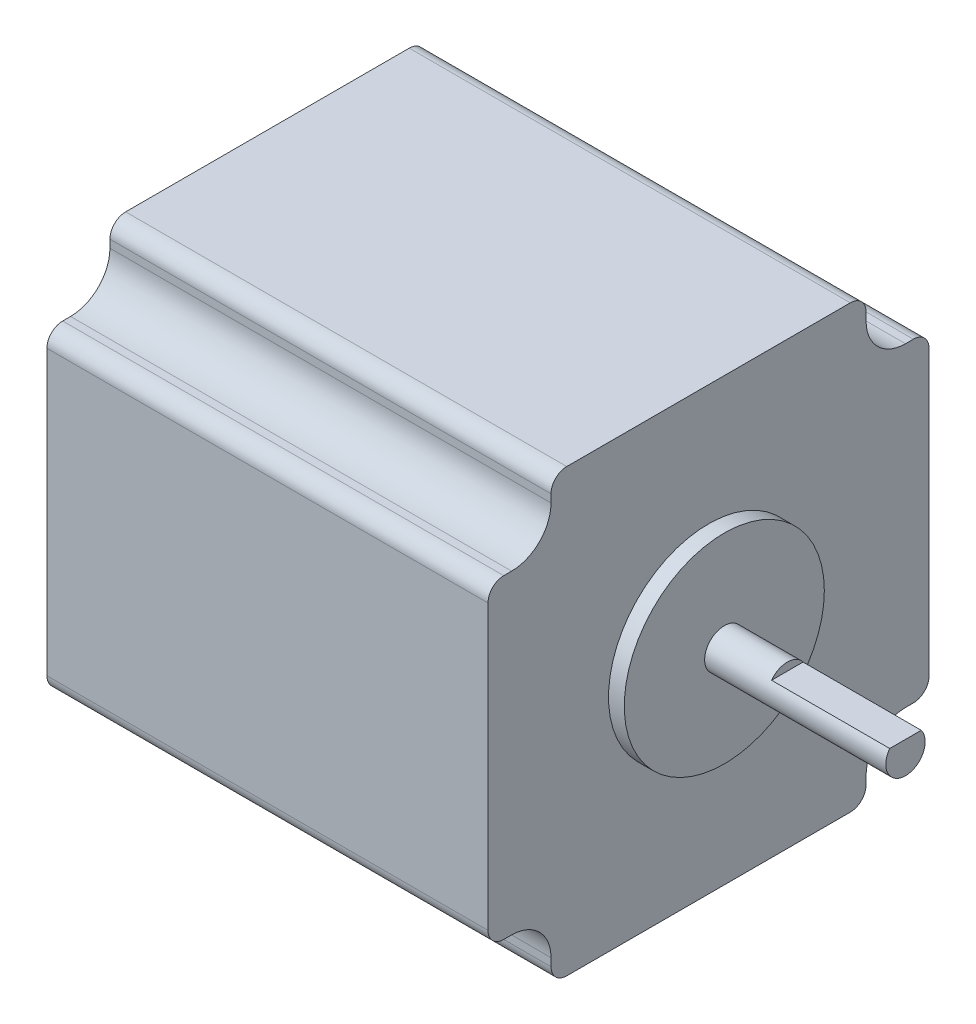
ISO-10303-21;
HEADER;
FILE_DESCRIPTION(('STEP AP214'),'2;1');
FILE_NAME('part.step','',(''),(''),'','','');
FILE_SCHEMA(('AUTOMOTIVE_DESIGN { 1 0 10303 214 1 1 1 1 }'));
ENDSEC;
DATA;
#1=APPLICATION_CONTEXT('core data for automotive mechanical design processes');
#2=APPLICATION_PROTOCOL_DEFINITION('international standard','automotive_design',2000,#1);
#3=PRODUCT_CONTEXT('',#1,'mechanical');
#4=PRODUCT('Part','Part','',(#3));
#5=PRODUCT_RELATED_PRODUCT_CATEGORY('part','',(#4));
#6=PRODUCT_DEFINITION_FORMATION('','',#4);
#7=PRODUCT_DEFINITION_CONTEXT('part definition',#1,'design');
#8=PRODUCT_DEFINITION('design','',#6,#7);
#9=PRODUCT_DEFINITION_SHAPE('','',#8);
#10=(LENGTH_UNIT() NAMED_UNIT(*) SI_UNIT(.MILLI.,.METRE.));
#11=(NAMED_UNIT(*) PLANE_ANGLE_UNIT() SI_UNIT($,.RADIAN.));
#12=(NAMED_UNIT(*) SI_UNIT($,.STERADIAN.) SOLID_ANGLE_UNIT());
#13=UNCERTAINTY_MEASURE_WITH_UNIT(LENGTH_MEASURE(1.E-05),#10,'distance_accuracy_value','');
#14=(GEOMETRIC_REPRESENTATION_CONTEXT(3) GLOBAL_UNCERTAINTY_ASSIGNED_CONTEXT((#13)) GLOBAL_UNIT_ASSIGNED_CONTEXT((#10,
#11,#12)) REPRESENTATION_CONTEXT('',''));
#15=CARTESIAN_POINT('',(0.,0.,0.));
#16=DIRECTION('',(0.,0.,1.));
#17=DIRECTION('',(1.,0.,0.));
#18=AXIS2_PLACEMENT_3D('',#15,#16,#17);
#19=CARTESIAN_POINT('',(-10.,-25.,-25.));
#20=DIRECTION('',(1.,0.,0.));
#21=DIRECTION('',(0.,0.,-1.));
#22=AXIS2_PLACEMENT_3D('',#19,#20,#21);
#23=CYLINDRICAL_SURFACE('',#22,5.);
#24=DIRECTION('',(1.,0.,0.));
#25=VECTOR('',#24,1.);
#26=CARTESIAN_POINT('',(-10.,-20.,-25.));
#27=LINE('',#26,#25);
#28=CARTESIAN_POINT('',(-10.,-20.,-25.));
#29=VERTEX_POINT('',#28);
#30=CARTESIAN_POINT('',(46.,-20.,-25.));
#31=VERTEX_POINT('',#30);
#32=EDGE_CURVE('E375',#29,#31,#27,.T.);
#33=ORIENTED_EDGE('',*,*,#32,.T.);
#34=CARTESIAN_POINT('',(46.,-25.,-25.));
#35=DIRECTION('',(-1.,0.,0.));
#36=DIRECTION('',(0.,0.,-1.));
#37=AXIS2_PLACEMENT_3D('',#34,#35,#36);
#38=CIRCLE('',#37,5.);
#39=CARTESIAN_POINT('',(46.,-25.,-20.));
#40=VERTEX_POINT('',#39);
#41=EDGE_CURVE('E263',#40,#31,#38,.T.);
#42=ORIENTED_EDGE('',*,*,#41,.F.);
#43=DIRECTION('',(1.,0.,0.));
#44=VECTOR('',#43,1.);
#45=CARTESIAN_POINT('',(-10.,-25.,-20.));
#46=LINE('',#45,#44);
#47=CARTESIAN_POINT('',(-10.,-25.,-20.));
#48=VERTEX_POINT('',#47);
#49=EDGE_CURVE('E11',#48,#40,#46,.T.);
#50=ORIENTED_EDGE('',*,*,#49,.F.);
#51=CARTESIAN_POINT('',(-10.,-25.,-25.));
#52=DIRECTION('',(-1.,0.,0.));
#53=DIRECTION('',(0.,0.,-1.));
#54=AXIS2_PLACEMENT_3D('',#51,#52,#53);
#55=CIRCLE('',#54,5.);
#56=EDGE_CURVE('E305',#48,#29,#55,.T.);
#57=ORIENTED_EDGE('',*,*,#56,.T.);
#58=EDGE_LOOP('',(#33,#42,#50,#57));
#59=FACE_BOUND('',#58,.T.);
#60=ADVANCED_FACE('F33',(#59),#23,.F.);
#61=CARTESIAN_POINT('',(-10.,-26.,-20.));
#62=DIRECTION('',(0.,0.,-1.));
#63=DIRECTION('',(-1.,0.,0.));
#64=AXIS2_PLACEMENT_3D('',#61,#62,#63);
#65=PLANE('',#64);
#66=ORIENTED_EDGE('',*,*,#49,.T.);
#67=DIRECTION('',(0.,1.,0.));
#68=VECTOR('',#67,1.);
#69=CARTESIAN_POINT('',(46.,-26.,-20.));
#70=LINE('',#69,#68);
#71=CARTESIAN_POINT('',(46.,-26.,-20.));
#72=VERTEX_POINT('',#71);
#73=EDGE_CURVE('E260',#72,#40,#70,.T.);
#74=ORIENTED_EDGE('',*,*,#73,.F.);
#75=DIRECTION('',(1.,0.,0.));
#76=VECTOR('',#75,1.);
#77=CARTESIAN_POINT('',(-10.,-26.,-20.));
#78=LINE('',#77,#76);
#79=CARTESIAN_POINT('',(-10.,-26.,-20.));
#80=VERTEX_POINT('',#79);
#81=EDGE_CURVE('E41',#80,#72,#78,.T.);
#82=ORIENTED_EDGE('',*,*,#81,.F.);
#83=DIRECTION('',(0.,1.,0.));
#84=VECTOR('',#83,1.);
#85=CARTESIAN_POINT('',(-10.,-26.,-20.));
#86=LINE('',#85,#84);
#87=EDGE_CURVE('E373',#80,#48,#86,.T.);
#88=ORIENTED_EDGE('',*,*,#87,.T.);
#89=EDGE_LOOP('',(#66,#74,#82,#88));
#90=FACE_BOUND('',#89,.T.);
#91=ADVANCED_FACE('F514',(#90),#65,.T.);
#92=CARTESIAN_POINT('',(-10.,-26.,-18.));
#93=DIRECTION('',(1.,0.,0.));
#94=DIRECTION('',(0.,0.,-1.));
#95=AXIS2_PLACEMENT_3D('',#92,#93,#94);
#96=CYLINDRICAL_SURFACE('',#95,2.);
#97=ORIENTED_EDGE('',*,*,#81,.T.);
#98=CARTESIAN_POINT('',(46.,-26.,-18.));
#99=DIRECTION('',(1.,0.,0.));
#100=DIRECTION('',(0.,0.,-1.));
#101=AXIS2_PLACEMENT_3D('',#98,#99,#100);
#102=CIRCLE('',#101,2.);
#103=CARTESIAN_POINT('',(46.,-28.,-18.));
#104=VERTEX_POINT('',#103);
#105=EDGE_CURVE('E257',#104,#72,#102,.T.);
#106=ORIENTED_EDGE('',*,*,#105,.F.);
#107=DIRECTION('',(1.,0.,0.));
#108=VECTOR('',#107,1.);
#109=CARTESIAN_POINT('',(-10.,-28.,-18.));
#110=LINE('',#109,#108);
#111=CARTESIAN_POINT('',(-10.,-28.,-18.));
#112=VERTEX_POINT('',#111);
#113=EDGE_CURVE('E378',#112,#104,#110,.T.);
#114=ORIENTED_EDGE('',*,*,#113,.F.);
#115=CARTESIAN_POINT('',(-10.,-26.,-18.));
#116=DIRECTION('',(1.,0.,0.));
#117=DIRECTION('',(0.,0.,1.));
#118=AXIS2_PLACEMENT_3D('',#115,#116,#117);
#119=CIRCLE('',#118,2.);
#120=EDGE_CURVE('E370',#112,#80,#119,.T.);
#121=ORIENTED_EDGE('',*,*,#120,.T.);
#122=EDGE_LOOP('',(#97,#106,#114,#121));
#123=FACE_BOUND('',#122,.T.);
#124=ADVANCED_FACE('F512',(#123),#96,.T.);
#125=CARTESIAN_POINT('',(-10.,-28.,-18.));
#126=DIRECTION('',(0.,-1.,0.));
#127=DIRECTION('',(0.,0.,-1.));
#128=AXIS2_PLACEMENT_3D('',#125,#126,#127);
#129=PLANE('',#128);
#130=ORIENTED_EDGE('',*,*,#113,.T.);
#131=DIRECTION('',(0.,0.,-1.));
#132=VECTOR('',#131,1.);
#133=CARTESIAN_POINT('',(46.,-28.,18.));
#134=LINE('',#133,#132);
#135=CARTESIAN_POINT('',(46.,-28.,18.));
#136=VERTEX_POINT('',#135);
#137=EDGE_CURVE('E254',#136,#104,#134,.T.);
#138=ORIENTED_EDGE('',*,*,#137,.F.);
#139=DIRECTION('',(1.,0.,0.));
#140=VECTOR('',#139,1.);
#141=CARTESIAN_POINT('',(-10.,-28.,18.));
#142=LINE('',#141,#140);
#143=CARTESIAN_POINT('',(-10.,-28.,18.));
#144=VERTEX_POINT('',#143);
#145=EDGE_CURVE('E380',#144,#136,#142,.T.);
#146=ORIENTED_EDGE('',*,*,#145,.F.);
#147=DIRECTION('',(0.,0.,-1.));
#148=VECTOR('',#147,1.);
#149=CARTESIAN_POINT('',(-10.,-28.,-18.));
#150=LINE('',#149,#148);
#151=EDGE_CURVE('E367',#144,#112,#150,.T.);
#152=ORIENTED_EDGE('',*,*,#151,.T.);
#153=EDGE_LOOP('',(#130,#138,#146,#152));
#154=FACE_BOUND('',#153,.T.);
#155=ADVANCED_FACE('F508',(#154),#129,.T.);
#156=CARTESIAN_POINT('',(-10.,-26.,18.));
#157=DIRECTION('',(1.,0.,0.));
#158=DIRECTION('',(0.,0.,-1.));
#159=AXIS2_PLACEMENT_3D('',#156,#157,#158);
#160=CYLINDRICAL_SURFACE('',#159,2.);
#161=ORIENTED_EDGE('',*,*,#145,.T.);
#162=CARTESIAN_POINT('',(46.,-26.,18.));
#163=DIRECTION('',(1.,0.,0.));
#164=DIRECTION('',(0.,0.,-1.));
#165=AXIS2_PLACEMENT_3D('',#162,#163,#164);
#166=CIRCLE('',#165,2.);
#167=CARTESIAN_POINT('',(46.,-26.,20.));
#168=VERTEX_POINT('',#167);
#169=EDGE_CURVE('E251',#168,#136,#166,.T.);
#170=ORIENTED_EDGE('',*,*,#169,.F.);
#171=DIRECTION('',(1.,0.,0.));
#172=VECTOR('',#171,1.);
#173=CARTESIAN_POINT('',(-10.,-26.,20.));
#174=LINE('',#173,#172);
#175=CARTESIAN_POINT('',(-10.,-26.,20.));
#176=VERTEX_POINT('',#175);
#177=EDGE_CURVE('E382',#176,#168,#174,.T.);
#178=ORIENTED_EDGE('',*,*,#177,.F.);
#179=CARTESIAN_POINT('',(-10.,-26.,18.));
#180=DIRECTION('',(1.,0.,0.));
#181=DIRECTION('',(0.,0.,-1.));
#182=AXIS2_PLACEMENT_3D('',#179,#180,#181);
#183=CIRCLE('',#182,2.);
#184=EDGE_CURVE('E364',#176,#144,#183,.T.);
#185=ORIENTED_EDGE('',*,*,#184,.T.);
#186=EDGE_LOOP('',(#161,#170,#178,#185));
#187=FACE_BOUND('',#186,.T.);
#188=ADVANCED_FACE('F503',(#187),#160,.T.);
#189=CARTESIAN_POINT('',(-10.,-26.,20.));
#190=DIRECTION('',(0.,0.,1.));
#191=DIRECTION('',(1.,0.,0.));
#192=AXIS2_PLACEMENT_3D('',#189,#190,#191);
#193=PLANE('',#192);
#194=ORIENTED_EDGE('',*,*,#177,.T.);
#195=DIRECTION('',(0.,-1.,0.));
#196=VECTOR('',#195,1.);
#197=CARTESIAN_POINT('',(46.,-25.,20.));
#198=LINE('',#197,#196);
#199=CARTESIAN_POINT('',(46.,-25.,20.));
#200=VERTEX_POINT('',#199);
#201=EDGE_CURVE('E248',#200,#168,#198,.T.);
#202=ORIENTED_EDGE('',*,*,#201,.F.);
#203=DIRECTION('',(1.,0.,0.));
#204=VECTOR('',#203,1.);
#205=CARTESIAN_POINT('',(-10.,-25.,20.));
#206=LINE('',#205,#204);
#207=CARTESIAN_POINT('',(-10.,-25.,20.));
#208=VERTEX_POINT('',#207);
#209=EDGE_CURVE('E384',#208,#200,#206,.T.);
#210=ORIENTED_EDGE('',*,*,#209,.F.);
#211=DIRECTION('',(0.,-1.,0.));
#212=VECTOR('',#211,1.);
#213=CARTESIAN_POINT('',(-10.,-26.,20.));
#214=LINE('',#213,#212);
#215=EDGE_CURVE('E361',#208,#176,#214,.T.);
#216=ORIENTED_EDGE('',*,*,#215,.T.);
#217=EDGE_LOOP('',(#194,#202,#210,#216));
#218=FACE_BOUND('',#217,.T.);
#219=ADVANCED_FACE('F501',(#218),#193,.T.);
#220=CARTESIAN_POINT('',(-10.,-25.,25.));
#221=DIRECTION('',(1.,0.,0.));
#222=DIRECTION('',(0.,0.,-1.));
#223=AXIS2_PLACEMENT_3D('',#220,#221,#222);
#224=CYLINDRICAL_SURFACE('',#223,5.);
#225=ORIENTED_EDGE('',*,*,#209,.T.);
#226=CARTESIAN_POINT('',(46.,-25.,25.));
#227=DIRECTION('',(-1.,0.,0.));
#228=DIRECTION('',(0.,0.,-1.));
#229=AXIS2_PLACEMENT_3D('',#226,#227,#228);
#230=CIRCLE('',#229,5.);
#231=CARTESIAN_POINT('',(46.,-20.,25.));
#232=VERTEX_POINT('',#231);
#233=EDGE_CURVE('E245',#232,#200,#230,.T.);
#234=ORIENTED_EDGE('',*,*,#233,.F.);
#235=DIRECTION('',(1.,0.,0.));
#236=VECTOR('',#235,1.);
#237=CARTESIAN_POINT('',(-10.,-20.,25.));
#238=LINE('',#237,#236);
#239=CARTESIAN_POINT('',(-10.,-20.,25.));
#240=VERTEX_POINT('',#239);
#241=EDGE_CURVE('E386',#240,#232,#238,.T.);
#242=ORIENTED_EDGE('',*,*,#241,.F.);
#243=CARTESIAN_POINT('',(-10.,-25.,25.));
#244=DIRECTION('',(-1.,0.,0.));
#245=DIRECTION('',(0.,0.,-1.));
#246=AXIS2_PLACEMENT_3D('',#243,#244,#245);
#247=CIRCLE('',#246,5.);
#248=EDGE_CURVE('E358',#240,#208,#247,.T.);
#249=ORIENTED_EDGE('',*,*,#248,.T.);
#250=EDGE_LOOP('',(#225,#234,#242,#249));
#251=FACE_BOUND('',#250,.T.);
#252=ADVANCED_FACE('F496',(#251),#224,.F.);
#253=CARTESIAN_POINT('',(-10.,-20.,25.));
#254=DIRECTION('',(0.,-1.,0.));
#255=DIRECTION('',(0.,0.,-1.));
#256=AXIS2_PLACEMENT_3D('',#253,#254,#255);
#257=PLANE('',#256);
#258=ORIENTED_EDGE('',*,*,#241,.T.);
#259=DIRECTION('',(0.,0.,-1.));
#260=VECTOR('',#259,1.);
#261=CARTESIAN_POINT('',(46.,-20.,26.));
#262=LINE('',#261,#260);
#263=CARTESIAN_POINT('',(46.,-20.,26.));
#264=VERTEX_POINT('',#263);
#265=EDGE_CURVE('E242',#264,#232,#262,.T.);
#266=ORIENTED_EDGE('',*,*,#265,.F.);
#267=DIRECTION('',(1.,0.,0.));
#268=VECTOR('',#267,1.);
#269=CARTESIAN_POINT('',(-10.,-20.,26.));
#270=LINE('',#269,#268);
#271=CARTESIAN_POINT('',(-10.,-20.,26.));
#272=VERTEX_POINT('',#271);
#273=EDGE_CURVE('E388',#272,#264,#270,.T.);
#274=ORIENTED_EDGE('',*,*,#273,.F.);
#275=DIRECTION('',(0.,0.,-1.));
#276=VECTOR('',#275,1.);
#277=CARTESIAN_POINT('',(-10.,-20.,25.));
#278=LINE('',#277,#276);
#279=EDGE_CURVE('E355',#272,#240,#278,.T.);
#280=ORIENTED_EDGE('',*,*,#279,.T.);
#281=EDGE_LOOP('',(#258,#266,#274,#280));
#282=FACE_BOUND('',#281,.T.);
#283=ADVANCED_FACE('F491',(#282),#257,.T.);
#284=CARTESIAN_POINT('',(-10.,-18.,26.));
#285=DIRECTION('',(1.,0.,0.));
#286=DIRECTION('',(0.,0.,-1.));
#287=AXIS2_PLACEMENT_3D('',#284,#285,#286);
#288=CYLINDRICAL_SURFACE('',#287,2.);
#289=ORIENTED_EDGE('',*,*,#273,.T.);
#290=CARTESIAN_POINT('',(46.,-18.,26.));
#291=DIRECTION('',(1.,0.,0.));
#292=DIRECTION('',(0.,0.,-1.));
#293=AXIS2_PLACEMENT_3D('',#290,#291,#292);
#294=CIRCLE('',#293,2.);
#295=CARTESIAN_POINT('',(46.,-18.,28.));
#296=VERTEX_POINT('',#295);
#297=EDGE_CURVE('E239',#296,#264,#294,.T.);
#298=ORIENTED_EDGE('',*,*,#297,.F.);
#299=DIRECTION('',(1.,0.,0.));
#300=VECTOR('',#299,1.);
#301=CARTESIAN_POINT('',(-10.,-18.,28.));
#302=LINE('',#301,#300);
#303=CARTESIAN_POINT('',(-10.,-18.,28.));
#304=VERTEX_POINT('',#303);
#305=EDGE_CURVE('E390',#304,#296,#302,.T.);
#306=ORIENTED_EDGE('',*,*,#305,.F.);
#307=CARTESIAN_POINT('',(-10.,-18.,26.));
#308=DIRECTION('',(1.,0.,0.));
#309=DIRECTION('',(0.,0.,1.));
#310=AXIS2_PLACEMENT_3D('',#307,#308,#309);
#311=CIRCLE('',#310,2.);
#312=EDGE_CURVE('E352',#304,#272,#311,.T.);
#313=ORIENTED_EDGE('',*,*,#312,.T.);
#314=EDGE_LOOP('',(#289,#298,#306,#313));
#315=FACE_BOUND('',#314,.T.);
#316=ADVANCED_FACE('F489',(#315),#288,.T.);
#317=CARTESIAN_POINT('',(-10.,18.,28.));
#318=DIRECTION('',(0.,0.,1.));
#319=DIRECTION('',(1.,0.,0.));
#320=AXIS2_PLACEMENT_3D('',#317,#318,#319);
#321=PLANE('',#320);
#322=ORIENTED_EDGE('',*,*,#305,.T.);
#323=DIRECTION('',(0.,-1.,0.));
#324=VECTOR('',#323,1.);
#325=CARTESIAN_POINT('',(46.,18.,28.));
#326=LINE('',#325,#324);
#327=CARTESIAN_POINT('',(46.,18.,28.));
#328=VERTEX_POINT('',#327);
#329=EDGE_CURVE('E236',#328,#296,#326,.T.);
#330=ORIENTED_EDGE('',*,*,#329,.F.);
#331=DIRECTION('',(1.,0.,0.));
#332=VECTOR('',#331,1.);
#333=CARTESIAN_POINT('',(-10.,18.,28.));
#334=LINE('',#333,#332);
#335=CARTESIAN_POINT('',(-10.,18.,28.));
#336=VERTEX_POINT('',#335);
#337=EDGE_CURVE('E392',#336,#328,#334,.T.);
#338=ORIENTED_EDGE('',*,*,#337,.F.);
#339=DIRECTION('',(0.,-1.,0.));
#340=VECTOR('',#339,1.);
#341=CARTESIAN_POINT('',(-10.,18.,28.));
#342=LINE('',#341,#340);
#343=EDGE_CURVE('E349',#336,#304,#342,.T.);
#344=ORIENTED_EDGE('',*,*,#343,.T.);
#345=EDGE_LOOP('',(#322,#330,#338,#344));
#346=FACE_BOUND('',#345,.T.);
#347=ADVANCED_FACE('F484',(#346),#321,.T.);
#348=CARTESIAN_POINT('',(-10.,18.,26.));
#349=DIRECTION('',(1.,0.,0.));
#350=DIRECTION('',(0.,0.,-1.));
#351=AXIS2_PLACEMENT_3D('',#348,#349,#350);
#352=CYLINDRICAL_SURFACE('',#351,2.);
#353=ORIENTED_EDGE('',*,*,#337,.T.);
#354=CARTESIAN_POINT('',(46.,18.,26.));
#355=DIRECTION('',(1.,0.,0.));
#356=DIRECTION('',(0.,0.,-1.));
#357=AXIS2_PLACEMENT_3D('',#354,#355,#356);
#358=CIRCLE('',#357,2.);
#359=CARTESIAN_POINT('',(46.,20.,26.));
#360=VERTEX_POINT('',#359);
#361=EDGE_CURVE('E233',#360,#328,#358,.T.);
#362=ORIENTED_EDGE('',*,*,#361,.F.);
#363=DIRECTION('',(1.,0.,0.));
#364=VECTOR('',#363,1.);
#365=CARTESIAN_POINT('',(-10.,20.,26.));
#366=LINE('',#365,#364);
#367=CARTESIAN_POINT('',(-10.,20.,26.));
#368=VERTEX_POINT('',#367);
#369=EDGE_CURVE('E394',#368,#360,#366,.T.);
#370=ORIENTED_EDGE('',*,*,#369,.F.);
#371=CARTESIAN_POINT('',(-10.,18.,26.));
#372=DIRECTION('',(1.,0.,0.));
#373=DIRECTION('',(0.,0.,-1.));
#374=AXIS2_PLACEMENT_3D('',#371,#372,#373);
#375=CIRCLE('',#374,2.);
#376=EDGE_CURVE('E346',#368,#336,#375,.T.);
#377=ORIENTED_EDGE('',*,*,#376,.T.);
#378=EDGE_LOOP('',(#353,#362,#370,#377));
#379=FACE_BOUND('',#378,.T.);
#380=ADVANCED_FACE('F479',(#379),#352,.T.);
#381=CARTESIAN_POINT('',(-10.,20.,25.));
#382=DIRECTION('',(0.,1.,0.));
#383=DIRECTION('',(0.,0.,1.));
#384=AXIS2_PLACEMENT_3D('',#381,#382,#383);
#385=PLANE('',#384);
#386=ORIENTED_EDGE('',*,*,#369,.T.);
#387=DIRECTION('',(0.,0.,1.));
#388=VECTOR('',#387,1.);
#389=CARTESIAN_POINT('',(46.,20.,25.));
#390=LINE('',#389,#388);
#391=CARTESIAN_POINT('',(46.,20.,25.));
#392=VERTEX_POINT('',#391);
#393=EDGE_CURVE('E302',#392,#360,#390,.T.);
#394=ORIENTED_EDGE('',*,*,#393,.F.);
#395=DIRECTION('',(1.,0.,0.));
#396=VECTOR('',#395,1.);
#397=CARTESIAN_POINT('',(-10.,20.,25.));
#398=LINE('',#397,#396);
#399=CARTESIAN_POINT('',(-10.,20.,25.));
#400=VERTEX_POINT('',#399);
#401=EDGE_CURVE('E396',#400,#392,#398,.T.);
#402=ORIENTED_EDGE('',*,*,#401,.F.);
#403=DIRECTION('',(0.,0.,1.));
#404=VECTOR('',#403,1.);
#405=CARTESIAN_POINT('',(-10.,20.,25.));
#406=LINE('',#405,#404);
#407=EDGE_CURVE('E343',#400,#368,#406,.T.);
#408=ORIENTED_EDGE('',*,*,#407,.T.);
#409=EDGE_LOOP('',(#386,#394,#402,#408));
#410=FACE_BOUND('',#409,.T.);
#411=ADVANCED_FACE('F477',(#410),#385,.T.);
#412=CARTESIAN_POINT('',(-10.,25.,25.));
#413=DIRECTION('',(1.,0.,0.));
#414=DIRECTION('',(0.,0.,-1.));
#415=AXIS2_PLACEMENT_3D('',#412,#413,#414);
#416=CYLINDRICAL_SURFACE('',#415,5.);
#417=ORIENTED_EDGE('',*,*,#401,.T.);
#418=CARTESIAN_POINT('',(46.,25.,25.));
#419=DIRECTION('',(-1.,0.,0.));
#420=DIRECTION('',(0.,0.,-1.));
#421=AXIS2_PLACEMENT_3D('',#418,#419,#420);
#422=CIRCLE('',#421,5.);
#423=CARTESIAN_POINT('',(46.,25.,20.));
#424=VERTEX_POINT('',#423);
#425=EDGE_CURVE('E299',#424,#392,#422,.T.);
#426=ORIENTED_EDGE('',*,*,#425,.F.);
#427=DIRECTION('',(1.,0.,0.));
#428=VECTOR('',#427,1.);
#429=CARTESIAN_POINT('',(-10.,25.,20.));
#430=LINE('',#429,#428);
#431=CARTESIAN_POINT('',(-10.,25.,20.));
#432=VERTEX_POINT('',#431);
#433=EDGE_CURVE('E398',#432,#424,#430,.T.);
#434=ORIENTED_EDGE('',*,*,#433,.F.);
#435=CARTESIAN_POINT('',(-10.,25.,25.));
#436=DIRECTION('',(-1.,0.,0.));
#437=DIRECTION('',(0.,0.,1.));
#438=AXIS2_PLACEMENT_3D('',#435,#436,#437);
#439=CIRCLE('',#438,5.);
#440=EDGE_CURVE('E340',#432,#400,#439,.T.);
#441=ORIENTED_EDGE('',*,*,#440,.T.);
#442=EDGE_LOOP('',(#417,#426,#434,#441));
#443=FACE_BOUND('',#442,.T.);
#444=ADVANCED_FACE('F472',(#443),#416,.F.);
#445=CARTESIAN_POINT('',(-10.,26.,20.));
#446=DIRECTION('',(0.,0.,1.));
#447=DIRECTION('',(1.,0.,0.));
#448=AXIS2_PLACEMENT_3D('',#445,#446,#447);
#449=PLANE('',#448);
#450=ORIENTED_EDGE('',*,*,#433,.T.);
#451=DIRECTION('',(0.,-1.,0.));
#452=VECTOR('',#451,1.);
#453=CARTESIAN_POINT('',(46.,26.,20.));
#454=LINE('',#453,#452);
#455=CARTESIAN_POINT('',(46.,26.,20.));
#456=VERTEX_POINT('',#455);
#457=EDGE_CURVE('E296',#456,#424,#454,.T.);
#458=ORIENTED_EDGE('',*,*,#457,.F.);
#459=DIRECTION('',(1.,0.,0.));
#460=VECTOR('',#459,1.);
#461=CARTESIAN_POINT('',(-10.,26.,20.));
#462=LINE('',#461,#460);
#463=CARTESIAN_POINT('',(-10.,26.,20.));
#464=VERTEX_POINT('',#463);
#465=EDGE_CURVE('E400',#464,#456,#462,.T.);
#466=ORIENTED_EDGE('',*,*,#465,.F.);
#467=DIRECTION('',(0.,-1.,0.));
#468=VECTOR('',#467,1.);
#469=CARTESIAN_POINT('',(-10.,26.,20.));
#470=LINE('',#469,#468);
#471=EDGE_CURVE('E337',#464,#432,#470,.T.);
#472=ORIENTED_EDGE('',*,*,#471,.T.);
#473=EDGE_LOOP('',(#450,#458,#466,#472));
#474=FACE_BOUND('',#473,.T.);
#475=ADVANCED_FACE('F467',(#474),#449,.T.);
#476=CARTESIAN_POINT('',(-10.,26.,18.));
#477=DIRECTION('',(1.,0.,0.));
#478=DIRECTION('',(0.,0.,-1.));
#479=AXIS2_PLACEMENT_3D('',#476,#477,#478);
#480=CYLINDRICAL_SURFACE('',#479,2.);
#481=ORIENTED_EDGE('',*,*,#465,.T.);
#482=CARTESIAN_POINT('',(46.,26.,18.));
#483=DIRECTION('',(1.,0.,0.));
#484=DIRECTION('',(0.,0.,-1.));
#485=AXIS2_PLACEMENT_3D('',#482,#483,#484);
#486=CIRCLE('',#485,2.);
#487=CARTESIAN_POINT('',(46.,28.,18.));
#488=VERTEX_POINT('',#487);
#489=EDGE_CURVE('E293',#488,#456,#486,.T.);
#490=ORIENTED_EDGE('',*,*,#489,.F.);
#491=DIRECTION('',(1.,0.,0.));
#492=VECTOR('',#491,1.);
#493=CARTESIAN_POINT('',(-10.,28.,18.));
#494=LINE('',#493,#492);
#495=CARTESIAN_POINT('',(-10.,28.,18.));
#496=VERTEX_POINT('',#495);
#497=EDGE_CURVE('E402',#496,#488,#494,.T.);
#498=ORIENTED_EDGE('',*,*,#497,.F.);
#499=CARTESIAN_POINT('',(-10.,26.,18.));
#500=DIRECTION('',(1.,0.,0.));
#501=DIRECTION('',(0.,0.,1.));
#502=AXIS2_PLACEMENT_3D('',#499,#500,#501);
#503=CIRCLE('',#502,2.);
#504=EDGE_CURVE('E334',#496,#464,#503,.T.);
#505=ORIENTED_EDGE('',*,*,#504,.T.);
#506=EDGE_LOOP('',(#481,#490,#498,#505));
#507=FACE_BOUND('',#506,.T.);
#508=ADVANCED_FACE('F465',(#507),#480,.T.);
#509=CARTESIAN_POINT('',(-10.,28.,-18.));
#510=DIRECTION('',(0.,1.,0.));
#511=DIRECTION('',(0.,0.,1.));
#512=AXIS2_PLACEMENT_3D('',#509,#510,#511);
#513=PLANE('',#512);
#514=ORIENTED_EDGE('',*,*,#497,.T.);
#515=DIRECTION('',(0.,0.,1.));
#516=VECTOR('',#515,1.);
#517=CARTESIAN_POINT('',(46.,28.,-18.));
#518=LINE('',#517,#516);
#519=CARTESIAN_POINT('',(46.,28.,-18.));
#520=VERTEX_POINT('',#519);
#521=EDGE_CURVE('E290',#520,#488,#518,.T.);
#522=ORIENTED_EDGE('',*,*,#521,.F.);
#523=DIRECTION('',(1.,0.,0.));
#524=VECTOR('',#523,1.);
#525=CARTESIAN_POINT('',(-10.,28.,-18.));
#526=LINE('',#525,#524);
#527=CARTESIAN_POINT('',(-10.,28.,-18.));
#528=VERTEX_POINT('',#527);
#529=EDGE_CURVE('E404',#528,#520,#526,.T.);
#530=ORIENTED_EDGE('',*,*,#529,.F.);
#531=DIRECTION('',(0.,0.,1.));
#532=VECTOR('',#531,1.);
#533=CARTESIAN_POINT('',(-10.,28.,-18.));
#534=LINE('',#533,#532);
#535=EDGE_CURVE('E331',#528,#496,#534,.T.);
#536=ORIENTED_EDGE('',*,*,#535,.T.);
#537=EDGE_LOOP('',(#514,#522,#530,#536));
#538=FACE_BOUND('',#537,.T.);
#539=ADVANCED_FACE('F460',(#538),#513,.T.);
#540=CARTESIAN_POINT('',(-10.,26.,-18.));
#541=DIRECTION('',(1.,0.,0.));
#542=DIRECTION('',(0.,0.,-1.));
#543=AXIS2_PLACEMENT_3D('',#540,#541,#542);
#544=CYLINDRICAL_SURFACE('',#543,2.);
#545=ORIENTED_EDGE('',*,*,#529,.T.);
#546=CARTESIAN_POINT('',(46.,26.,-18.));
#547=DIRECTION('',(1.,0.,0.));
#548=DIRECTION('',(0.,0.,-1.));
#549=AXIS2_PLACEMENT_3D('',#546,#547,#548);
#550=CIRCLE('',#549,2.);
#551=CARTESIAN_POINT('',(46.,26.,-20.));
#552=VERTEX_POINT('',#551);
#553=EDGE_CURVE('E287',#552,#520,#550,.T.);
#554=ORIENTED_EDGE('',*,*,#553,.F.);
#555=DIRECTION('',(1.,0.,0.));
#556=VECTOR('',#555,1.);
#557=CARTESIAN_POINT('',(-10.,26.,-20.));
#558=LINE('',#557,#556);
#559=CARTESIAN_POINT('',(-10.,26.,-20.));
#560=VERTEX_POINT('',#559);
#561=EDGE_CURVE('E406',#560,#552,#558,.T.);
#562=ORIENTED_EDGE('',*,*,#561,.F.);
#563=CARTESIAN_POINT('',(-10.,26.,-18.));
#564=DIRECTION('',(1.,0.,0.));
#565=DIRECTION('',(0.,0.,-1.));
#566=AXIS2_PLACEMENT_3D('',#563,#564,#565);
#567=CIRCLE('',#566,2.);
#568=EDGE_CURVE('E328',#560,#528,#567,.T.);
#569=ORIENTED_EDGE('',*,*,#568,.T.);
#570=EDGE_LOOP('',(#545,#554,#562,#569));
#571=FACE_BOUND('',#570,.T.);
#572=ADVANCED_FACE('F455',(#571),#544,.T.);
#573=CARTESIAN_POINT('',(-10.,26.,-20.));
#574=DIRECTION('',(0.,0.,-1.));
#575=DIRECTION('',(-1.,0.,0.));
#576=AXIS2_PLACEMENT_3D('',#573,#574,#575);
#577=PLANE('',#576);
#578=ORIENTED_EDGE('',*,*,#561,.T.);
#579=DIRECTION('',(0.,1.,0.));
#580=VECTOR('',#579,1.);
#581=CARTESIAN_POINT('',(46.,25.,-20.));
#582=LINE('',#581,#580);
#583=CARTESIAN_POINT('',(46.,25.,-20.));
#584=VERTEX_POINT('',#583);
#585=EDGE_CURVE('E284',#584,#552,#582,.T.);
#586=ORIENTED_EDGE('',*,*,#585,.F.);
#587=DIRECTION('',(1.,0.,0.));
#588=VECTOR('',#587,1.);
#589=CARTESIAN_POINT('',(-10.,25.,-20.));
#590=LINE('',#589,#588);
#591=CARTESIAN_POINT('',(-10.,25.,-20.));
#592=VERTEX_POINT('',#591);
#593=EDGE_CURVE('E408',#592,#584,#590,.T.);
#594=ORIENTED_EDGE('',*,*,#593,.F.);
#595=DIRECTION('',(0.,1.,0.));
#596=VECTOR('',#595,1.);
#597=CARTESIAN_POINT('',(-10.,26.,-20.));
#598=LINE('',#597,#596);
#599=EDGE_CURVE('E325',#592,#560,#598,.T.);
#600=ORIENTED_EDGE('',*,*,#599,.T.);
#601=EDGE_LOOP('',(#578,#586,#594,#600));
#602=FACE_BOUND('',#601,.T.);
#603=ADVANCED_FACE('F453',(#602),#577,.T.);
#604=CARTESIAN_POINT('',(-10.,25.,-25.));
#605=DIRECTION('',(1.,0.,0.));
#606=DIRECTION('',(0.,0.,-1.));
#607=AXIS2_PLACEMENT_3D('',#604,#605,#606);
#608=CYLINDRICAL_SURFACE('',#607,5.);
#609=ORIENTED_EDGE('',*,*,#593,.T.);
#610=CARTESIAN_POINT('',(46.,25.,-25.));
#611=DIRECTION('',(-1.,0.,0.));
#612=DIRECTION('',(0.,0.,-1.));
#613=AXIS2_PLACEMENT_3D('',#610,#611,#612);
#614=CIRCLE('',#613,5.);
#615=CARTESIAN_POINT('',(46.,20.,-25.));
#616=VERTEX_POINT('',#615);
#617=EDGE_CURVE('E281',#616,#584,#614,.T.);
#618=ORIENTED_EDGE('',*,*,#617,.F.);
#619=DIRECTION('',(1.,0.,0.));
#620=VECTOR('',#619,1.);
#621=CARTESIAN_POINT('',(-10.,20.,-25.));
#622=LINE('',#621,#620);
#623=CARTESIAN_POINT('',(-10.,20.,-25.));
#624=VERTEX_POINT('',#623);
#625=EDGE_CURVE('E410',#624,#616,#622,.T.);
#626=ORIENTED_EDGE('',*,*,#625,.F.);
#627=CARTESIAN_POINT('',(-10.,25.,-25.));
#628=DIRECTION('',(-1.,0.,0.));
#629=DIRECTION('',(0.,0.,-1.));
#630=AXIS2_PLACEMENT_3D('',#627,#628,#629);
#631=CIRCLE('',#630,5.);
#632=EDGE_CURVE('E322',#624,#592,#631,.T.);
#633=ORIENTED_EDGE('',*,*,#632,.T.);
#634=EDGE_LOOP('',(#609,#618,#626,#633));
#635=FACE_BOUND('',#634,.T.);
#636=ADVANCED_FACE('F448',(#635),#608,.F.);
#637=CARTESIAN_POINT('',(-10.,20.,-25.));
#638=DIRECTION('',(0.,1.,0.));
#639=DIRECTION('',(0.,0.,1.));
#640=AXIS2_PLACEMENT_3D('',#637,#638,#639);
#641=PLANE('',#640);
#642=ORIENTED_EDGE('',*,*,#625,.T.);
#643=DIRECTION('',(0.,0.,1.));
#644=VECTOR('',#643,1.);
#645=CARTESIAN_POINT('',(46.,20.,-26.));
#646=LINE('',#645,#644);
#647=CARTESIAN_POINT('',(46.,20.,-26.));
#648=VERTEX_POINT('',#647);
#649=EDGE_CURVE('E278',#648,#616,#646,.T.);
#650=ORIENTED_EDGE('',*,*,#649,.F.);
#651=DIRECTION('',(1.,0.,0.));
#652=VECTOR('',#651,1.);
#653=CARTESIAN_POINT('',(-10.,20.,-26.));
#654=LINE('',#653,#652);
#655=CARTESIAN_POINT('',(-10.,20.,-26.));
#656=VERTEX_POINT('',#655);
#657=EDGE_CURVE('E412',#656,#648,#654,.T.);
#658=ORIENTED_EDGE('',*,*,#657,.F.);
#659=DIRECTION('',(0.,0.,1.));
#660=VECTOR('',#659,1.);
#661=CARTESIAN_POINT('',(-10.,20.,-25.));
#662=LINE('',#661,#660);
#663=EDGE_CURVE('E319',#656,#624,#662,.T.);
#664=ORIENTED_EDGE('',*,*,#663,.T.);
#665=EDGE_LOOP('',(#642,#650,#658,#664));
#666=FACE_BOUND('',#665,.T.);
#667=ADVANCED_FACE('F443',(#666),#641,.T.);
#668=CARTESIAN_POINT('',(-10.,18.,-26.));
#669=DIRECTION('',(1.,0.,0.));
#670=DIRECTION('',(0.,0.,-1.));
#671=AXIS2_PLACEMENT_3D('',#668,#669,#670);
#672=CYLINDRICAL_SURFACE('',#671,2.);
#673=ORIENTED_EDGE('',*,*,#657,.T.);
#674=CARTESIAN_POINT('',(46.,18.,-26.));
#675=DIRECTION('',(1.,0.,0.));
#676=DIRECTION('',(0.,0.,-1.));
#677=AXIS2_PLACEMENT_3D('',#674,#675,#676);
#678=CIRCLE('',#677,2.);
#679=CARTESIAN_POINT('',(46.,18.,-28.));
#680=VERTEX_POINT('',#679);
#681=EDGE_CURVE('E275',#680,#648,#678,.T.);
#682=ORIENTED_EDGE('',*,*,#681,.F.);
#683=DIRECTION('',(1.,0.,0.));
#684=VECTOR('',#683,1.);
#685=CARTESIAN_POINT('',(-10.,18.,-28.));
#686=LINE('',#685,#684);
#687=CARTESIAN_POINT('',(-10.,18.,-28.));
#688=VERTEX_POINT('',#687);
#689=EDGE_CURVE('E414',#688,#680,#686,.T.);
#690=ORIENTED_EDGE('',*,*,#689,.F.);
#691=CARTESIAN_POINT('',(-10.,18.,-26.));
#692=DIRECTION('',(1.,0.,0.));
#693=DIRECTION('',(0.,0.,1.));
#694=AXIS2_PLACEMENT_3D('',#691,#692,#693);
#695=CIRCLE('',#694,2.);
#696=EDGE_CURVE('E316',#688,#656,#695,.T.);
#697=ORIENTED_EDGE('',*,*,#696,.T.);
#698=EDGE_LOOP('',(#673,#682,#690,#697));
#699=FACE_BOUND('',#698,.T.);
#700=ADVANCED_FACE('F441',(#699),#672,.T.);
#701=CARTESIAN_POINT('',(-10.,18.,-28.));
#702=DIRECTION('',(0.,0.,-1.));
#703=DIRECTION('',(-1.,0.,0.));
#704=AXIS2_PLACEMENT_3D('',#701,#702,#703);
#705=PLANE('',#704);
#706=ORIENTED_EDGE('',*,*,#689,.T.);
#707=DIRECTION('',(0.,1.,0.));
#708=VECTOR('',#707,1.);
#709=CARTESIAN_POINT('',(46.,-18.,-28.));
#710=LINE('',#709,#708);
#711=CARTESIAN_POINT('',(46.,-18.,-28.));
#712=VERTEX_POINT('',#711);
#713=EDGE_CURVE('E272',#712,#680,#710,.T.);
#714=ORIENTED_EDGE('',*,*,#713,.F.);
#715=DIRECTION('',(1.,0.,0.));
#716=VECTOR('',#715,1.);
#717=CARTESIAN_POINT('',(-10.,-18.,-28.));
#718=LINE('',#717,#716);
#719=CARTESIAN_POINT('',(-10.,-18.,-28.));
#720=VERTEX_POINT('',#719);
#721=EDGE_CURVE('E416',#720,#712,#718,.T.);
#722=ORIENTED_EDGE('',*,*,#721,.F.);
#723=DIRECTION('',(0.,1.,0.));
#724=VECTOR('',#723,1.);
#725=CARTESIAN_POINT('',(-10.,18.,-28.));
#726=LINE('',#725,#724);
#727=EDGE_CURVE('E313',#720,#688,#726,.T.);
#728=ORIENTED_EDGE('',*,*,#727,.T.);
#729=EDGE_LOOP('',(#706,#714,#722,#728));
#730=FACE_BOUND('',#729,.T.);
#731=ADVANCED_FACE('F436',(#730),#705,.T.);
#732=CARTESIAN_POINT('',(-10.,-18.,-26.));
#733=DIRECTION('',(1.,0.,0.));
#734=DIRECTION('',(0.,0.,-1.));
#735=AXIS2_PLACEMENT_3D('',#732,#733,#734);
#736=CYLINDRICAL_SURFACE('',#735,2.);
#737=ORIENTED_EDGE('',*,*,#721,.T.);
#738=CARTESIAN_POINT('',(46.,-18.,-26.));
#739=DIRECTION('',(1.,0.,0.));
#740=DIRECTION('',(0.,0.,-1.));
#741=AXIS2_PLACEMENT_3D('',#738,#739,#740);
#742=CIRCLE('',#741,2.);
#743=CARTESIAN_POINT('',(46.,-20.,-26.));
#744=VERTEX_POINT('',#743);
#745=EDGE_CURVE('E269',#744,#712,#742,.T.);
#746=ORIENTED_EDGE('',*,*,#745,.F.);
#747=DIRECTION('',(1.,0.,0.));
#748=VECTOR('',#747,1.);
#749=CARTESIAN_POINT('',(-10.,-20.,-26.));
#750=LINE('',#749,#748);
#751=CARTESIAN_POINT('',(-10.,-20.,-26.));
#752=VERTEX_POINT('',#751);
#753=EDGE_CURVE('E418',#752,#744,#750,.T.);
#754=ORIENTED_EDGE('',*,*,#753,.F.);
#755=CARTESIAN_POINT('',(-10.,-18.,-26.));
#756=DIRECTION('',(1.,0.,0.));
#757=DIRECTION('',(0.,0.,-1.));
#758=AXIS2_PLACEMENT_3D('',#755,#756,#757);
#759=CIRCLE('',#758,2.);
#760=EDGE_CURVE('E310',#752,#720,#759,.T.);
#761=ORIENTED_EDGE('',*,*,#760,.T.);
#762=EDGE_LOOP('',(#737,#746,#754,#761));
#763=FACE_BOUND('',#762,.T.);
#764=ADVANCED_FACE('F429',(#763),#736,.T.);
#765=CARTESIAN_POINT('',(-10.,-20.,-25.));
#766=DIRECTION('',(0.,-1.,0.));
#767=DIRECTION('',(0.,0.,-1.));
#768=AXIS2_PLACEMENT_3D('',#765,#766,#767);
#769=PLANE('',#768);
#770=ORIENTED_EDGE('',*,*,#753,.T.);
#771=DIRECTION('',(0.,0.,-1.));
#772=VECTOR('',#771,1.);
#773=CARTESIAN_POINT('',(46.,-20.,-25.));
#774=LINE('',#773,#772);
#775=EDGE_CURVE('E266',#31,#744,#774,.T.);
#776=ORIENTED_EDGE('',*,*,#775,.F.);
#777=ORIENTED_EDGE('',*,*,#32,.F.);
#778=DIRECTION('',(0.,0.,-1.));
#779=VECTOR('',#778,1.);
#780=CARTESIAN_POINT('',(-10.,-20.,-25.));
#781=LINE('',#780,#779);
#782=EDGE_CURVE('E307',#29,#752,#781,.T.);
#783=ORIENTED_EDGE('',*,*,#782,.T.);
#784=EDGE_LOOP('',(#770,#776,#777,#783));
#785=FACE_BOUND('',#784,.T.);
#786=ADVANCED_FACE('F426',(#785),#769,.T.);
#787=CARTESIAN_POINT('',(-10.,-25.,-25.));
#788=DIRECTION('',(1.,0.,0.));
#789=DIRECTION('',(0.,0.,-1.));
#790=AXIS2_PLACEMENT_3D('',#787,#788,#789);
#791=PLANE('',#790);
#792=ORIENTED_EDGE('',*,*,#56,.F.);
#793=ORIENTED_EDGE('',*,*,#87,.F.);
#794=ORIENTED_EDGE('',*,*,#120,.F.);
#795=ORIENTED_EDGE('',*,*,#151,.F.);
#796=ORIENTED_EDGE('',*,*,#184,.F.);
#797=ORIENTED_EDGE('',*,*,#215,.F.);
#798=ORIENTED_EDGE('',*,*,#248,.F.);
#799=ORIENTED_EDGE('',*,*,#279,.F.);
#800=ORIENTED_EDGE('',*,*,#312,.F.);
#801=ORIENTED_EDGE('',*,*,#343,.F.);
#802=ORIENTED_EDGE('',*,*,#376,.F.);
#803=ORIENTED_EDGE('',*,*,#407,.F.);
#804=ORIENTED_EDGE('',*,*,#440,.F.);
#805=ORIENTED_EDGE('',*,*,#471,.F.);
#806=ORIENTED_EDGE('',*,*,#504,.F.);
#807=ORIENTED_EDGE('',*,*,#535,.F.);
#808=ORIENTED_EDGE('',*,*,#568,.F.);
#809=ORIENTED_EDGE('',*,*,#599,.F.);
#810=ORIENTED_EDGE('',*,*,#632,.F.);
#811=ORIENTED_EDGE('',*,*,#663,.F.);
#812=ORIENTED_EDGE('',*,*,#696,.F.);
#813=ORIENTED_EDGE('',*,*,#727,.F.);
#814=ORIENTED_EDGE('',*,*,#760,.F.);
#815=ORIENTED_EDGE('',*,*,#782,.F.);
#816=EDGE_LOOP('',(#792,#793,#794,#795,#796,#797,#798,#799,#800,#801,#802,#803,#804,#805,#806,
#807,#808,#809,#810,#811,#812,#813,#814,#815));
#817=FACE_BOUND('',#816,.T.);
#818=ADVANCED_FACE('F432',(#817),#791,.F.);
#819=CARTESIAN_POINT('',(46.,18.,26.));
#820=DIRECTION('',(1.,0.,0.));
#821=DIRECTION('',(0.,0.,-1.));
#822=AXIS2_PLACEMENT_3D('',#819,#820,#821);
#823=PLANE('',#822);
#824=CARTESIAN_POINT('',(46.,0.,0.));
#825=DIRECTION('',(1.,0.,0.));
#826=DIRECTION('',(0.,0.,-1.));
#827=AXIS2_PLACEMENT_3D('',#824,#825,#826);
#828=CIRCLE('',#827,12.7);
#829=CARTESIAN_POINT('',(46.,0.,-12.7));
#830=VERTEX_POINT('',#829);
#831=EDGE_CURVE('E223',#830,#830,#828,.T.);
#832=ORIENTED_EDGE('',*,*,#831,.F.);
#833=EDGE_LOOP('',(#832));
#834=FACE_BOUND('',#833,.T.);
#835=ORIENTED_EDGE('',*,*,#361,.T.);
#836=ORIENTED_EDGE('',*,*,#329,.T.);
#837=ORIENTED_EDGE('',*,*,#297,.T.);
#838=ORIENTED_EDGE('',*,*,#265,.T.);
#839=ORIENTED_EDGE('',*,*,#233,.T.);
#840=ORIENTED_EDGE('',*,*,#201,.T.);
#841=ORIENTED_EDGE('',*,*,#169,.T.);
#842=ORIENTED_EDGE('',*,*,#137,.T.);
#843=ORIENTED_EDGE('',*,*,#105,.T.);
#844=ORIENTED_EDGE('',*,*,#73,.T.);
#845=ORIENTED_EDGE('',*,*,#41,.T.);
#846=ORIENTED_EDGE('',*,*,#775,.T.);
#847=ORIENTED_EDGE('',*,*,#745,.T.);
#848=ORIENTED_EDGE('',*,*,#713,.T.);
#849=ORIENTED_EDGE('',*,*,#681,.T.);
#850=ORIENTED_EDGE('',*,*,#649,.T.);
#851=ORIENTED_EDGE('',*,*,#617,.T.);
#852=ORIENTED_EDGE('',*,*,#585,.T.);
#853=ORIENTED_EDGE('',*,*,#553,.T.);
#854=ORIENTED_EDGE('',*,*,#521,.T.);
#855=ORIENTED_EDGE('',*,*,#489,.T.);
#856=ORIENTED_EDGE('',*,*,#457,.T.);
#857=ORIENTED_EDGE('',*,*,#425,.T.);
#858=ORIENTED_EDGE('',*,*,#393,.T.);
#859=EDGE_LOOP('',(#835,#836,#837,#838,#839,#840,#841,#842,#843,#844,#845,#846,#847,#848,#849,
#850,#851,#852,#853,#854,#855,#856,#857,#858));
#860=FACE_BOUND('',#859,.T.);
#861=ADVANCED_FACE('F423',(#834,#860),#823,.T.);
#862=CARTESIAN_POINT('',(48.,0.,0.));
#863=DIRECTION('',(-1.,0.,0.));
#864=DIRECTION('',(0.,0.,1.));
#865=AXIS2_PLACEMENT_3D('',#862,#863,#864);
#866=CYLINDRICAL_SURFACE('',#865,12.7);
#867=CARTESIAN_POINT('',(48.,0.,0.));
#868=DIRECTION('',(1.,0.,0.));
#869=DIRECTION('',(0.,0.,-1.));
#870=AXIS2_PLACEMENT_3D('',#867,#868,#869);
#871=CIRCLE('',#870,12.7);
#872=CARTESIAN_POINT('',(48.,0.,-12.7));
#873=VERTEX_POINT('',#872);
#874=EDGE_CURVE('E227',#873,#873,#871,.T.);
#875=ORIENTED_EDGE('',*,*,#874,.F.);
#876=EDGE_LOOP('',(#875));
#877=FACE_BOUND('',#876,.T.);
#878=ORIENTED_EDGE('',*,*,#831,.T.);
#879=EDGE_LOOP('',(#878));
#880=FACE_BOUND('',#879,.T.);
#881=ADVANCED_FACE('F571',(#877,#880),#866,.T.);
#882=CARTESIAN_POINT('',(48.,0.,0.));
#883=DIRECTION('',(1.,0.,0.));
#884=DIRECTION('',(0.,0.,-1.));
#885=AXIS2_PLACEMENT_3D('',#882,#883,#884);
#886=PLANE('',#885);
#887=CARTESIAN_POINT('',(48.,0.,0.));
#888=DIRECTION('',(1.,0.,0.));
#889=DIRECTION('',(0.,0.,-1.));
#890=AXIS2_PLACEMENT_3D('',#887,#888,#889);
#891=CIRCLE('',#890,2.5);
#892=CARTESIAN_POINT('',(48.,0.,-2.5));
#893=VERTEX_POINT('',#892);
#894=EDGE_CURVE('E36',#893,#893,#891,.T.);
#895=ORIENTED_EDGE('',*,*,#894,.F.);
#896=EDGE_LOOP('',(#895));
#897=FACE_BOUND('',#896,.T.);
#898=ORIENTED_EDGE('',*,*,#874,.T.);
#899=EDGE_LOOP('',(#898));
#900=FACE_BOUND('',#899,.T.);
#901=ADVANCED_FACE('F576',(#897,#900),#886,.T.);
#902=CARTESIAN_POINT('',(71.,0.,0.));
#903=DIRECTION('',(1.,0.,0.));
#904=DIRECTION('',(0.,0.,-1.));
#905=AXIS2_PLACEMENT_3D('',#902,#903,#904);
#906=PLANE('',#905);
#907=DIRECTION('',(0.,0.,-1.));
#908=VECTOR('',#907,1.);
#909=CARTESIAN_POINT('',(71.,1.5,2.));
#910=LINE('',#909,#908);
#911=CARTESIAN_POINT('',(71.,1.5,2.));
#912=VERTEX_POINT('',#911);
#913=CARTESIAN_POINT('',(71.,1.5,-2.));
#914=VERTEX_POINT('',#913);
#915=EDGE_CURVE('E209',#912,#914,#910,.T.);
#916=ORIENTED_EDGE('',*,*,#915,.F.);
#917=CARTESIAN_POINT('',(71.,0.,0.));
#918=DIRECTION('',(1.,0.,0.));
#919=DIRECTION('',(0.,0.,-1.));
#920=AXIS2_PLACEMENT_3D('',#917,#918,#919);
#921=CIRCLE('',#920,2.5);
#922=EDGE_CURVE('E221',#912,#914,#921,.T.);
#923=ORIENTED_EDGE('',*,*,#922,.T.);
#924=EDGE_LOOP('',(#916,#923));
#925=FACE_BOUND('',#924,.T.);
#926=ADVANCED_FACE('F583',(#925),#906,.T.);
#927=CARTESIAN_POINT('',(71.,0.,0.));
#928=DIRECTION('',(-1.,0.,0.));
#929=DIRECTION('',(0.,0.,1.));
#930=AXIS2_PLACEMENT_3D('',#927,#928,#929);
#931=CYLINDRICAL_SURFACE('',#930,2.5);
#932=ORIENTED_EDGE('',*,*,#922,.F.);
#933=DIRECTION('',(1.,0.,0.));
#934=VECTOR('',#933,1.);
#935=CARTESIAN_POINT('',(56.,1.5,2.));
#936=LINE('',#935,#934);
#937=CARTESIAN_POINT('',(56.,1.5,2.));
#938=VERTEX_POINT('',#937);
#939=EDGE_CURVE('E213',#938,#912,#936,.T.);
#940=ORIENTED_EDGE('',*,*,#939,.F.);
#941=CARTESIAN_POINT('',(56.,0.,0.));
#942=DIRECTION('',(1.,0.,0.));
#943=DIRECTION('',(0.,0.,-1.));
#944=AXIS2_PLACEMENT_3D('',#941,#942,#943);
#945=CIRCLE('',#944,2.5);
#946=CARTESIAN_POINT('',(56.,1.5,-2.));
#947=VERTEX_POINT('',#946);
#948=EDGE_CURVE('E204',#947,#938,#945,.T.);
#949=ORIENTED_EDGE('',*,*,#948,.F.);
#950=DIRECTION('',(1.,0.,0.));
#951=VECTOR('',#950,1.);
#952=CARTESIAN_POINT('',(56.,1.5,-2.));
#953=LINE('',#952,#951);
#954=EDGE_CURVE('E215',#947,#914,#953,.T.);
#955=ORIENTED_EDGE('',*,*,#954,.T.);
#956=EDGE_LOOP('',(#932,#940,#949,#955));
#957=FACE_BOUND('',#956,.T.);
#958=ORIENTED_EDGE('',*,*,#894,.T.);
#959=EDGE_LOOP('',(#958));
#960=FACE_BOUND('',#959,.T.);
#961=ADVANCED_FACE('F218',(#957,#960),#931,.T.);
#962=CARTESIAN_POINT('',(56.,1.5,2.));
#963=DIRECTION('',(0.,-1.,0.));
#964=DIRECTION('',(0.,0.,-1.));
#965=AXIS2_PLACEMENT_3D('',#962,#963,#964);
#966=PLANE('',#965);
#967=ORIENTED_EDGE('',*,*,#915,.T.);
#968=ORIENTED_EDGE('',*,*,#954,.F.);
#969=DIRECTION('',(0.,0.,-1.));
#970=VECTOR('',#969,1.);
#971=CARTESIAN_POINT('',(56.,1.5,2.));
#972=LINE('',#971,#970);
#973=EDGE_CURVE('E48',#938,#947,#972,.T.);
#974=ORIENTED_EDGE('',*,*,#973,.F.);
#975=ORIENTED_EDGE('',*,*,#939,.T.);
#976=EDGE_LOOP('',(#967,#968,#974,#975));
#977=FACE_BOUND('',#976,.T.);
#978=ADVANCED_FACE('F212',(#977),#966,.F.);
#979=CARTESIAN_POINT('',(56.,0.,0.));
#980=DIRECTION('',(1.,0.,0.));
#981=DIRECTION('',(0.,0.,-1.));
#982=AXIS2_PLACEMENT_3D('',#979,#980,#981);
#983=PLANE('',#982);
#984=ORIENTED_EDGE('',*,*,#948,.T.);
#985=ORIENTED_EDGE('',*,*,#973,.T.);
#986=EDGE_LOOP('',(#984,#985));
#987=FACE_BOUND('',#986,.T.);
#988=ADVANCED_FACE('F205',(#987),#983,.T.);
#989=CLOSED_SHELL('',(#60,#91,#124,#155,#188,#219,#252,#283,#316,#347,#380,#411,#444,#475,#508,
#539,#572,#603,#636,#667,#700,#731,#764,#786,#818,#861,#881,#901,#926,#961,#978,#988));
#990=MANIFOLD_SOLID_BREP('B2',#989);
#991=ADVANCED_BREP_SHAPE_REPRESENTATION('',(#18,#990),#14);
#992=SHAPE_DEFINITION_REPRESENTATION(#9,#991);
ENDSEC;
END-ISO-10303-21;
